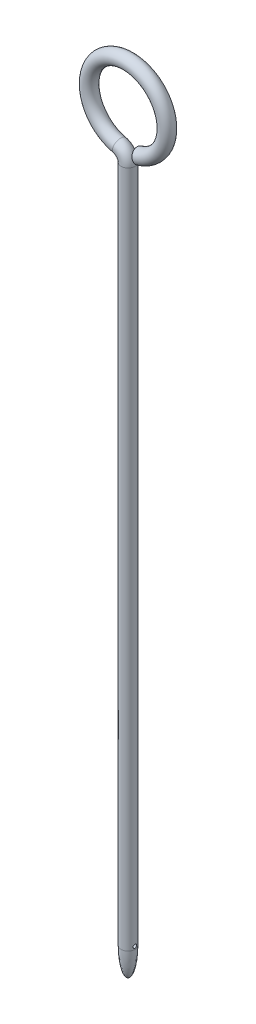
ISO-10303-21;
HEADER;
FILE_DESCRIPTION(('STEP AP214'),'2;1');
FILE_NAME('part.step','',(''),(''),'','','');
FILE_SCHEMA(('AUTOMOTIVE_DESIGN { 1 0 10303 214 1 1 1 1 }'));
ENDSEC;
DATA;
#1=APPLICATION_CONTEXT('core data for automotive mechanical design processes');
#2=APPLICATION_PROTOCOL_DEFINITION('international standard','automotive_design',2000,#1);
#3=PRODUCT_CONTEXT('',#1,'mechanical');
#4=PRODUCT('Part','Part','',(#3));
#5=PRODUCT_RELATED_PRODUCT_CATEGORY('part','',(#4));
#6=PRODUCT_DEFINITION_FORMATION('','',#4);
#7=PRODUCT_DEFINITION_CONTEXT('part definition',#1,'design');
#8=PRODUCT_DEFINITION('design','',#6,#7);
#9=PRODUCT_DEFINITION_SHAPE('','',#8);
#10=(LENGTH_UNIT() NAMED_UNIT(*) SI_UNIT(.MILLI.,.METRE.));
#11=(NAMED_UNIT(*) PLANE_ANGLE_UNIT() SI_UNIT($,.RADIAN.));
#12=(NAMED_UNIT(*) SI_UNIT($,.STERADIAN.) SOLID_ANGLE_UNIT());
#13=UNCERTAINTY_MEASURE_WITH_UNIT(LENGTH_MEASURE(1.E-05),#10,'distance_accuracy_value','');
#14=(GEOMETRIC_REPRESENTATION_CONTEXT(3) GLOBAL_UNCERTAINTY_ASSIGNED_CONTEXT((#13)) GLOBAL_UNIT_ASSIGNED_CONTEXT((#10,
#11,#12)) REPRESENTATION_CONTEXT('',''));
#15=CARTESIAN_POINT('',(0.,0.,0.));
#16=DIRECTION('',(0.,0.,1.));
#17=DIRECTION('',(1.,0.,0.));
#18=AXIS2_PLACEMENT_3D('',#15,#16,#17);
#19=CARTESIAN_POINT('',(0.,152.4,0.));
#20=DIRECTION('',(0.,-1.,0.));
#21=DIRECTION('',(0.,0.,-1.));
#22=AXIS2_PLACEMENT_3D('',#19,#20,#21);
#23=CYLINDRICAL_SURFACE('',#22,1.5875);
#24=CARTESIAN_POINT('',(-1.53709026552607,0.635,-0.396875));
#25=CARTESIAN_POINT('',(-1.53709068397695,0.656915556704099,-0.396874377477234));
#26=CARTESIAN_POINT('',(-1.53756408616901,0.678838002649321,-0.395053541476327));
#27=CARTESIAN_POINT('',(-1.53940170629111,0.722053353020444,-0.387829921170921));
#28=CARTESIAN_POINT('',(-1.54076644266315,0.743345883518924,-0.382425052195799));
#29=CARTESIAN_POINT('',(-1.54422272519539,0.784670061692361,-0.368219227940323));
#30=CARTESIAN_POINT('',(-1.54631333274402,0.804703298418862,-0.359422656796561));
#31=CARTESIAN_POINT('',(-1.55098462987274,0.843011847839328,-0.338696481175582));
#32=CARTESIAN_POINT('',(-1.55356534025817,0.861287085854863,-0.326766743684099));
#33=CARTESIAN_POINT('',(-1.55898963720709,0.895963036185759,-0.299832462835667));
#34=CARTESIAN_POINT('',(-1.56183742372457,0.912319359055673,-0.284771605922991));
#35=CARTESIAN_POINT('',(-1.56743856488253,0.942302121354603,-0.252123902676003));
#36=CARTESIAN_POINT('',(-1.57019191067468,0.955928305567426,-0.234536820451128));
#37=CARTESIAN_POINT('',(-1.57534040963838,0.980245605486495,-0.197031800671274));
#38=CARTESIAN_POINT('',(-1.57773002874829,0.990893114120642,-0.17708476397097));
#39=CARTESIAN_POINT('',(-1.58183391393265,1.0086672810093,-0.135614280506474));
#40=CARTESIAN_POINT('',(-1.58354827964331,1.01579445874159,-0.114091066869467));
#41=CARTESIAN_POINT('',(-1.58607880467145,1.02618346873935,-0.0705419529522188));
#42=CARTESIAN_POINT('',(-1.58691245647784,1.02952068103685,-0.0485350692283959));
#43=CARTESIAN_POINT('',(-1.58764858064535,1.03247164270999,-0.00425907505796115));
#44=CARTESIAN_POINT('',(-1.58755119067852,1.03208594258827,0.0180099961329218));
#45=CARTESIAN_POINT('',(-1.58644922573873,1.02765624252279,0.0616554230965444));
#46=CARTESIAN_POINT('',(-1.58546482871614,1.0236936083977,0.0830406230666764));
#47=CARTESIAN_POINT('',(-1.58272295298321,1.0123533108798,0.124832366942309));
#48=CARTESIAN_POINT('',(-1.58096543312003,1.00497546569634,0.145238858687645));
#49=CARTESIAN_POINT('',(-1.57684392165017,0.986948341903428,0.184708285452281));
#50=CARTESIAN_POINT('',(-1.5744745937659,0.976270106659947,0.203757414813583));
#51=CARTESIAN_POINT('',(-1.56938647229782,0.951967285940293,0.239821887616383));
#52=CARTESIAN_POINT('',(-1.56666761794833,0.938342187866,0.256836876424561));
#53=CARTESIAN_POINT('',(-1.56108989560911,0.908096237210297,0.288835320174343));
#54=CARTESIAN_POINT('',(-1.55822922974739,0.89140428583979,0.303751328882971));
#55=CARTESIAN_POINT('',(-1.55275763158277,0.855726004200484,0.330587499210324));
#56=CARTESIAN_POINT('',(-1.55014671095573,0.836739566755802,0.342507520805764));
#57=CARTESIAN_POINT('',(-1.54546378872024,0.79687895707885,0.363056538705844));
#58=CARTESIAN_POINT('',(-1.54339446166458,0.775996077812778,0.371669296891414));
#59=CARTESIAN_POINT('',(-1.54006334122218,0.733014556942861,0.385240855690048));
#60=CARTESIAN_POINT('',(-1.53880137503622,0.710916176592674,0.390200438225687));
#61=CARTESIAN_POINT('',(-1.53726412771214,0.666756429133201,0.396212955138097));
#62=CARTESIAN_POINT('',(-1.53696366643617,0.644709500308918,0.397365612734741));
#63=CARTESIAN_POINT('',(-1.53731490777615,0.600738267568214,0.396004572244343));
#64=CARTESIAN_POINT('',(-1.53796652274201,0.578813952550237,0.393491211658496));
#65=CARTESIAN_POINT('',(-1.54012436760287,0.536080610438436,0.384956917400103));
#66=CARTESIAN_POINT('',(-1.54161644024707,0.515259204656875,0.378994045839726));
#67=CARTESIAN_POINT('',(-1.54527364025515,0.474911506066042,0.363794370465209));
#68=CARTESIAN_POINT('',(-1.54743884734467,0.455385366999961,0.354557178824365));
#69=CARTESIAN_POINT('',(-1.55225136763556,0.417759947138555,0.332862343534926));
#70=CARTESIAN_POINT('',(-1.55490730516304,0.399696171643155,0.320345078421404));
#71=CARTESIAN_POINT('',(-1.56038086937635,0.365888847405283,0.29252080375836));
#72=CARTESIAN_POINT('',(-1.56319852258145,0.350145680731799,0.277213335750907));
#73=CARTESIAN_POINT('',(-1.56876337731268,0.321022496991859,0.243785517390811));
#74=CARTESIAN_POINT('',(-1.57150705202317,0.307711465070375,0.225604368660974));
#75=CARTESIAN_POINT('',(-1.5765418313743,0.284331431121489,0.187207002194447));
#76=CARTESIAN_POINT('',(-1.57883295961879,0.274262259988446,0.166990890680042));
#77=CARTESIAN_POINT('',(-1.58269005873457,0.25773919201869,0.125237161312025));
#78=CARTESIAN_POINT('',(-1.58426123016058,0.251259294854824,0.103710335595439));
#79=CARTESIAN_POINT('',(-1.58652415326581,0.242020671880913,0.0598288111265253));
#80=CARTESIAN_POINT('',(-1.58721607466204,0.239261227925175,0.037474273000742));
#81=CARTESIAN_POINT('',(-1.58763560984122,0.23758223788721,-0.00678002455719676));
#82=CARTESIAN_POINT('',(-1.58738879118003,0.238560884202767,-0.0286757375771462));
#83=CARTESIAN_POINT('',(-1.5860152765654,0.244097106457438,-0.0719802251396018));
#84=CARTESIAN_POINT('',(-1.58488860677972,0.248654575958326,-0.0933890141442915));
#85=CARTESIAN_POINT('',(-1.58188593663917,0.261164474721588,-0.135005379771539));
#86=CARTESIAN_POINT('',(-1.58001400286997,0.269098495534242,-0.155218802536844));
#87=CARTESIAN_POINT('',(-1.57571792787498,0.288119573548297,-0.194038955425835));
#88=CARTESIAN_POINT('',(-1.5732937170466,0.299207028215737,-0.21264548262707));
#89=CARTESIAN_POINT('',(-1.56808189717283,0.32453073349259,-0.248206390343238));
#90=CARTESIAN_POINT('',(-1.56528697350304,0.338836056716364,-0.265110510981798));
#91=CARTESIAN_POINT('',(-1.55968163842991,0.370055319377108,-0.296312836170156));
#92=CARTESIAN_POINT('',(-1.55687122327993,0.386969919201374,-0.310610379011435));
#93=CARTESIAN_POINT('',(-1.55149341982208,0.423307436261142,-0.33645555425895));
#94=CARTESIAN_POINT('',(-1.54893154355499,0.442771261479332,-0.347946908342868));
#95=CARTESIAN_POINT('',(-1.5444150735895,0.483415772563133,-0.367477237094326));
#96=CARTESIAN_POINT('',(-1.54246003834661,0.504595195923832,-0.375518723560825));
#97=CARTESIAN_POINT('',(-1.53968413781709,0.543947751568555,-0.386723941024461));
#98=CARTESIAN_POINT('',(-1.53871875630412,0.561932599614251,-0.39052228958022));
#99=CARTESIAN_POINT('',(-1.5374216718658,0.598276707384958,-0.395597972364838));
#100=CARTESIAN_POINT('',(-1.5370899148866,0.616635935036969,-0.3968755216408));
#101=CARTESIAN_POINT('',(-1.53709026552607,0.635,-0.396875));
#102=B_SPLINE_CURVE_WITH_KNOTS('',3,(#24,#25,#26,#27,#28,#29,#30,#31,#32,#33,#34,#35,#36,#37,
#38,#39,#40,#41,#42,#43,#44,#45,#46,#47,#48,#49,#50,#51,#52,#53,#54,#55,#56,#57,#58,#59,#60,#61,
#62,#63,#64,#65,#66,#67,#68,#69,#70,#71,#72,#73,#74,#75,#76,#77,#78,#79,#80,#81,#82,#83,#84,#85,
#86,#87,#88,#89,#90,#91,#92,#93,#94,#95,#96,#97,#98,#99,#100,#101),.UNSPECIFIED.,.T.,.F.,(4,2,2,
2,2,2,2,2,2,2,2,2,2,2,2,2,2,2,2,2,2,2,2,2,2,2,2,2,2,2,2,2,2,2,2,2,2,2,4),(0.,0.0656792313679823,
0.131396698937016,0.197029502922821,0.262665093709538,0.329603027266566,0.396547215334505,
0.464425500516916,0.532293766242477,0.59878714219033,0.665270685992525,0.73027899200392,
0.795290758785814,0.860889937864147,0.926500536917115,0.993886865668126,1.0612763432649,
1.12899258579856,1.19669433019087,1.26260792491944,1.3285154518895,1.39334463043733,
1.45818149024172,1.52429026778663,1.59040991746523,1.65818396289266,1.72595447244001,
1.79322741556622,1.86048737137831,1.92592872071255,1.99136812382117,2.05645524152376,
2.12155056659441,2.18820539080926,2.25487711259546,2.32279265767464,2.39065867015473,
2.44569905062923,2.5007347354557),.UNSPECIFIED.);
#103=CARTESIAN_POINT('',(-1.53709026552607,0.635,-0.396875));
#104=VERTEX_POINT('',#103);
#105=EDGE_CURVE('E37',#104,#104,#102,.T.);
#106=ORIENTED_EDGE('',*,*,#105,.T.);
#107=EDGE_LOOP('',(#106));
#108=FACE_BOUND('',#107,.T.);
#109=CARTESIAN_POINT('',(1.53709026552607,0.635,-0.396875));
#110=CARTESIAN_POINT('',(1.53709068397696,0.613084443295901,-0.396874377477234));
#111=CARTESIAN_POINT('',(1.53756408616901,0.591161997350679,-0.395053541476327));
#112=CARTESIAN_POINT('',(1.53940170629111,0.547946646979557,-0.387829921170921));
#113=CARTESIAN_POINT('',(1.54076644266315,0.526654116481077,-0.3824250521958));
#114=CARTESIAN_POINT('',(1.54422272519539,0.48532993830764,-0.368219227940324));
#115=CARTESIAN_POINT('',(1.54631333274402,0.46529670158114,-0.359422656796562));
#116=CARTESIAN_POINT('',(1.55098462987274,0.426988152160675,-0.338696481175584));
#117=CARTESIAN_POINT('',(1.55356534025817,0.40871291414514,-0.326766743684101));
#118=CARTESIAN_POINT('',(1.55898963720709,0.374036963814244,-0.299832462835669));
#119=CARTESIAN_POINT('',(1.56183742372456,0.357680640944329,-0.284771605922994));
#120=CARTESIAN_POINT('',(1.56743856488253,0.3276978786454,-0.252123902676007));
#121=CARTESIAN_POINT('',(1.57019191067468,0.314071694432577,-0.234536820451133));
#122=CARTESIAN_POINT('',(1.57534040963838,0.289754394513508,-0.19703180067128));
#123=CARTESIAN_POINT('',(1.57773002874829,0.279106885879361,-0.177084763970976));
#124=CARTESIAN_POINT('',(1.58183391393265,0.261332718990707,-0.135614280506481));
#125=CARTESIAN_POINT('',(1.58354827964331,0.254205541258415,-0.114091066869474));
#126=CARTESIAN_POINT('',(1.58607880467145,0.243816531260648,-0.0705419529522262));
#127=CARTESIAN_POINT('',(1.58691245647784,0.240479318963155,-0.0485350692284031));
#128=CARTESIAN_POINT('',(1.58764858064535,0.237528357290006,-0.00425907505796802));
#129=CARTESIAN_POINT('',(1.58755119067852,0.237914057411726,0.0180099961329152));
#130=CARTESIAN_POINT('',(1.58644922573873,0.24234375747721,0.0616554230965383));
#131=CARTESIAN_POINT('',(1.58546482871614,0.246306391602299,0.0830406230666708));
#132=CARTESIAN_POINT('',(1.58272295298321,0.257646689120198,0.124832366942304));
#133=CARTESIAN_POINT('',(1.58096543312003,0.265024534303663,0.145238858687641));
#134=CARTESIAN_POINT('',(1.57684392165017,0.283051658096571,0.184708285452278));
#135=CARTESIAN_POINT('',(1.5744745937659,0.293729893340051,0.20375741481358));
#136=CARTESIAN_POINT('',(1.56938647229782,0.318032714059705,0.23982188761638));
#137=CARTESIAN_POINT('',(1.56666761794833,0.331657812133997,0.256836876424559));
#138=CARTESIAN_POINT('',(1.56108989560911,0.361903762789701,0.288835320174341));
#139=CARTESIAN_POINT('',(1.5582292297474,0.378595714160208,0.303751328882969));
#140=CARTESIAN_POINT('',(1.55275763158277,0.414273995799514,0.330587499210322));
#141=CARTESIAN_POINT('',(1.55014671095573,0.433260433244195,0.342507520805762));
#142=CARTESIAN_POINT('',(1.54546378872024,0.473121042921147,0.363056538705843));
#143=CARTESIAN_POINT('',(1.54339446166458,0.494003922187218,0.371669296891413));
#144=CARTESIAN_POINT('',(1.54006334122218,0.536985443057134,0.385240855690047));
#145=CARTESIAN_POINT('',(1.53880137503622,0.55908382340732,0.390200438225686));
#146=CARTESIAN_POINT('',(1.53726412771214,0.603243570866792,0.396212955138096));
#147=CARTESIAN_POINT('',(1.53696366643617,0.625290499691075,0.397365612734741));
#148=CARTESIAN_POINT('',(1.53731490777615,0.669261732431779,0.396004572244343));
#149=CARTESIAN_POINT('',(1.53796652274201,0.691186047449756,0.393491211658497));
#150=CARTESIAN_POINT('',(1.54012436760287,0.733919389561556,0.384956917400105));
#151=CARTESIAN_POINT('',(1.54161644024707,0.754740795343118,0.378994045839728));
#152=CARTESIAN_POINT('',(1.54527364025515,0.795088493933951,0.363794370465212));
#153=CARTESIAN_POINT('',(1.54743884734467,0.814614633000032,0.354557178824368));
#154=CARTESIAN_POINT('',(1.55225136763555,0.852240052861439,0.33286234353493));
#155=CARTESIAN_POINT('',(1.55490730516304,0.87030382835684,0.320345078421408));
#156=CARTESIAN_POINT('',(1.56038086937635,0.904111152594713,0.292520803758364));
#157=CARTESIAN_POINT('',(1.56319852258145,0.919854319268197,0.277213335750911));
#158=CARTESIAN_POINT('',(1.56876337731268,0.948977503008138,0.243785517390815));
#159=CARTESIAN_POINT('',(1.57150705202316,0.962288534929623,0.225604368660978));
#160=CARTESIAN_POINT('',(1.5765418313743,0.985668568878509,0.187207002194451));
#161=CARTESIAN_POINT('',(1.57883295961879,0.995737740011552,0.166990890680045));
#162=CARTESIAN_POINT('',(1.58269005873457,1.01226080798131,0.125237161312028));
#163=CARTESIAN_POINT('',(1.58426123016058,1.01874070514518,0.103710335595442));
#164=CARTESIAN_POINT('',(1.58652415326581,1.02797932811909,0.0598288111265283));
#165=CARTESIAN_POINT('',(1.58721607466204,1.03073877207482,0.037474273000745));
#166=CARTESIAN_POINT('',(1.58763560984122,1.03241776211279,-0.00678002455719357));
#167=CARTESIAN_POINT('',(1.58738879118003,1.03143911579723,-0.0286757375771427));
#168=CARTESIAN_POINT('',(1.5860152765654,1.02590289354256,-0.0719802251395978));
#169=CARTESIAN_POINT('',(1.58488860677972,1.02134542404168,-0.0933890141442872));
#170=CARTESIAN_POINT('',(1.58188593663917,1.00883552527841,-0.135005379771534));
#171=CARTESIAN_POINT('',(1.58001400286997,1.00090150446576,-0.15521880253684));
#172=CARTESIAN_POINT('',(1.57571792787498,0.981880426451706,-0.19403895542583));
#173=CARTESIAN_POINT('',(1.57329371704661,0.970792971784266,-0.212645482627064));
#174=CARTESIAN_POINT('',(1.56808189717283,0.945469266507415,-0.248206390343233));
#175=CARTESIAN_POINT('',(1.56528697350304,0.931163943283641,-0.265110510981793));
#176=CARTESIAN_POINT('',(1.55968163842991,0.899944680622897,-0.296312836170151));
#177=CARTESIAN_POINT('',(1.55687122327993,0.883030080798631,-0.310610379011431));
#178=CARTESIAN_POINT('',(1.55149341982208,0.846692563738864,-0.336455554258946));
#179=CARTESIAN_POINT('',(1.54893154355499,0.827228738520674,-0.347946908342865));
#180=CARTESIAN_POINT('',(1.5444150735895,0.786584227436873,-0.367477237094324));
#181=CARTESIAN_POINT('',(1.54246003834661,0.765404804076174,-0.375518723560823));
#182=CARTESIAN_POINT('',(1.53968413781709,0.726052248431449,-0.38672394102446));
#183=CARTESIAN_POINT('',(1.53871875630411,0.708067400385753,-0.390522289580219));
#184=CARTESIAN_POINT('',(1.5374216718658,0.671723292615044,-0.395597972364838));
#185=CARTESIAN_POINT('',(1.5370899148866,0.653364064963032,-0.3968755216408));
#186=CARTESIAN_POINT('',(1.53709026552607,0.635,-0.396875));
#187=B_SPLINE_CURVE_WITH_KNOTS('',3,(#109,#110,#111,#112,#113,#114,#115,#116,#117,#118,#119,
#120,#121,#122,#123,#124,#125,#126,#127,#128,#129,#130,#131,#132,#133,#134,#135,#136,#137,#138,
#139,#140,#141,#142,#143,#144,#145,#146,#147,#148,#149,#150,#151,#152,#153,#154,#155,#156,#157,
#158,#159,#160,#161,#162,#163,#164,#165,#166,#167,#168,#169,#170,#171,#172,#173,#174,#175,#176,
#177,#178,#179,#180,#181,#182,#183,#184,#185,#186),.UNSPECIFIED.,.T.,.F.,(4,2,2,2,2,2,2,2,2,2,2,
2,2,2,2,2,2,2,2,2,2,2,2,2,2,2,2,2,2,2,2,2,2,2,2,2,2,2,4),(0.,0.0656792313679816,
0.131396698937014,0.197029502922819,0.262665093709535,0.329603027266562,0.396547215334499,
0.464425500516909,0.532293766242469,0.598787142190323,0.665270685992518,0.730278992003915,
0.79529075878581,0.860889937864143,0.926500536917113,0.993886865668122,1.0612763432649,
1.12899258579855,1.19669433019087,1.26260792491944,1.3285154518895,1.39334463043733,
1.45818149024171,1.52429026778662,1.59040991746522,1.65818396289266,1.72595447244,
1.79322741556621,1.86048737137831,1.92592872071255,1.99136812382117,2.05645524152375,
2.1215505665944,2.18820539080925,2.25487711259546,2.32279265767464,2.39065867015472,
2.44569905062922,2.5007347354557),.UNSPECIFIED.);
#188=CARTESIAN_POINT('',(1.53709026552607,0.635,-0.396875));
#189=VERTEX_POINT('',#188);
#190=EDGE_CURVE('E65',#189,#189,#187,.T.);
#191=ORIENTED_EDGE('',*,*,#190,.T.);
#192=EDGE_LOOP('',(#191));
#193=FACE_BOUND('',#192,.T.);
#194=CARTESIAN_POINT('',(0.,0.,0.));
#195=DIRECTION('',(0.,1.,0.));
#196=DIRECTION('',(0.,0.,1.));
#197=AXIS2_PLACEMENT_3D('',#194,#195,#196);
#198=CIRCLE('',#197,1.5875);
#199=CARTESIAN_POINT('',(0.,0.,1.5875));
#200=VERTEX_POINT('',#199);
#201=EDGE_CURVE('E11',#200,#200,#198,.T.);
#202=ORIENTED_EDGE('',*,*,#201,.T.);
#203=EDGE_LOOP('',(#202));
#204=FACE_BOUND('',#203,.T.);
#205=CARTESIAN_POINT('',(0.,154.94,0.));
#206=DIRECTION('',(0.,1.,0.));
#207=DIRECTION('',(0.,0.,1.));
#208=AXIS2_PLACEMENT_3D('',#205,#206,#207);
#209=CIRCLE('',#208,1.5875);
#210=CARTESIAN_POINT('',(0.,154.94,1.5875));
#211=VERTEX_POINT('',#210);
#212=EDGE_CURVE('E58',#211,#211,#209,.T.);
#213=ORIENTED_EDGE('',*,*,#212,.F.);
#214=EDGE_LOOP('',(#213));
#215=FACE_BOUND('',#214,.T.);
#216=ADVANCED_FACE('F32',(#108,#193,#204,#215),#23,.T.);
#217=CARTESIAN_POINT('',(0.,0.,0.));
#218=DIRECTION('',(-1.,0.,0.));
#219=DIRECTION('',(0.,-1.,0.));
#220=AXIS2_PLACEMENT_3D('',#217,#218,#219);
#221=ELLIPSE('',#220,6.35,1.5875);
#222=TRIMMED_CURVE('',#221,(PARAMETER_VALUE(0.)),(PARAMETER_VALUE(3.14159265358979)),.T.,.PARAMETER.);
#223=CARTESIAN_POINT('',(0.,6.35,0.));
#224=DIRECTION('',(0.,-1.,0.));
#225=AXIS1_PLACEMENT('',#223,#224);
#226=SURFACE_OF_REVOLUTION('',#222,#225);
#227=CARTESIAN_POINT('',(0.,-6.35,0.));
#228=VERTEX_POINT('',#227);
#229=VERTEX_LOOP('',#228);
#230=FACE_BOUND('',#229,.T.);
#231=ORIENTED_EDGE('',*,*,#201,.F.);
#232=EDGE_LOOP('',(#231));
#233=FACE_BOUND('',#232,.T.);
#234=ADVANCED_FACE('F34',(#230,#233),#226,.F.);
#235=CARTESIAN_POINT('',(0.,166.084204771988,0.));
#236=DIRECTION('',(0.,0.,-1.));
#237=DIRECTION('',(-1.,0.,0.));
#238=AXIS2_PLACEMENT_3D('',#235,#236,#237);
#239=TOROIDAL_SURFACE('',#238,8.89,1.5875);
#240=CARTESIAN_POINT('',(-1.97555555555556,157.416489949331,0.));
#241=DIRECTION('',(-0.974996043043569,0.222222222222222,0.));
#242=DIRECTION('',(0.,0.,1.));
#243=AXIS2_PLACEMENT_3D('',#240,#241,#242);
#244=CIRCLE('',#243,1.5875);
#245=CARTESIAN_POINT('',(-2.32833333333334,155.868683730999,0.));
#246=VERTEX_POINT('',#245);
#247=EDGE_CURVE('E60',#246,#246,#244,.T.);
#248=CARTESIAN_POINT('',(2.53999999999988,157.564785777714,0.));
#249=DIRECTION('',(-0.958314847499914,-0.285714285714273,0.));
#250=DIRECTION('',(0.,0.,1.));
#251=AXIS2_PLACEMENT_3D('',#248,#249,#250);
#252=CIRCLE('',#251,1.5875);
#253=CARTESIAN_POINT('',(2.99357142857129,156.043460957308,0.));
#254=VERTEX_POINT('',#253);
#255=EDGE_CURVE('E44',#254,#254,#252,.T.);
#256=CARTESIAN_POINT('',(0.,166.084204771988,0.));
#257=DIRECTION('',(0.,0.,-1.));
#258=DIRECTION('',(-1.,0.,0.));
#259=AXIS2_PLACEMENT_3D('',#256,#257,#258);
#260=CIRCLE('',#259,10.4775);
#261=EDGE_CURVE('',#246,#254,#260,.T.);
#262=ORIENTED_EDGE('',*,*,#247,.T.);
#263=ORIENTED_EDGE('',*,*,#255,.F.);
#264=ORIENTED_EDGE('',*,*,#261,.T.);
#265=ORIENTED_EDGE('',*,*,#261,.F.);
#266=EDGE_LOOP('',(#262,#264,#263,#265));
#267=FACE_BOUND('',#266,.T.);
#268=ADVANCED_FACE('F50',(#267),#239,.T.);
#269=CARTESIAN_POINT('',(-2.54,154.94,0.));
#270=DIRECTION('',(0.,0.,1.));
#271=DIRECTION('',(1.,0.,0.));
#272=AXIS2_PLACEMENT_3D('',#269,#270,#271);
#273=TOROIDAL_SURFACE('',#272,2.54,1.5875);
#274=ORIENTED_EDGE('',*,*,#212,.T.);
#275=EDGE_LOOP('',(#274));
#276=FACE_BOUND('',#275,.T.);
#277=ORIENTED_EDGE('',*,*,#247,.F.);
#278=EDGE_LOOP('',(#277));
#279=FACE_BOUND('',#278,.T.);
#280=ADVANCED_FACE('F83',(#276,#279),#273,.T.);
#281=CARTESIAN_POINT('',(2.53999999999988,157.564785777714,0.));
#282=DIRECTION('',(-0.958314847499914,-0.285714285714273,0.));
#283=DIRECTION('',(0.,0.,1.));
#284=AXIS2_PLACEMENT_3D('',#281,#282,#283);
#285=PLANE('',#284);
#286=ORIENTED_EDGE('',*,*,#255,.T.);
#287=EDGE_LOOP('',(#286));
#288=FACE_BOUND('',#287,.T.);
#289=ADVANCED_FACE('F78',(#288),#285,.T.);
#290=CARTESIAN_POINT('',(-10.4775,0.635,0.));
#291=DIRECTION('',(1.,0.,0.));
#292=DIRECTION('',(0.,0.,-1.));
#293=AXIS2_PLACEMENT_3D('',#290,#291,#292);
#294=CYLINDRICAL_SURFACE('',#293,0.396875);
#295=ORIENTED_EDGE('',*,*,#190,.F.);
#296=EDGE_LOOP('',(#295));
#297=FACE_BOUND('',#296,.T.);
#298=ORIENTED_EDGE('',*,*,#105,.F.);
#299=EDGE_LOOP('',(#298));
#300=FACE_BOUND('',#299,.T.);
#301=ADVANCED_FACE('F74',(#297,#300),#294,.F.);
#302=CLOSED_SHELL('',(#216,#234,#268,#280,#289,#301));
#303=MANIFOLD_SOLID_BREP('B2',#302);
#304=ADVANCED_BREP_SHAPE_REPRESENTATION('',(#18,#303),#14);
#305=SHAPE_DEFINITION_REPRESENTATION(#9,#304);
ENDSEC;
END-ISO-10303-21;
